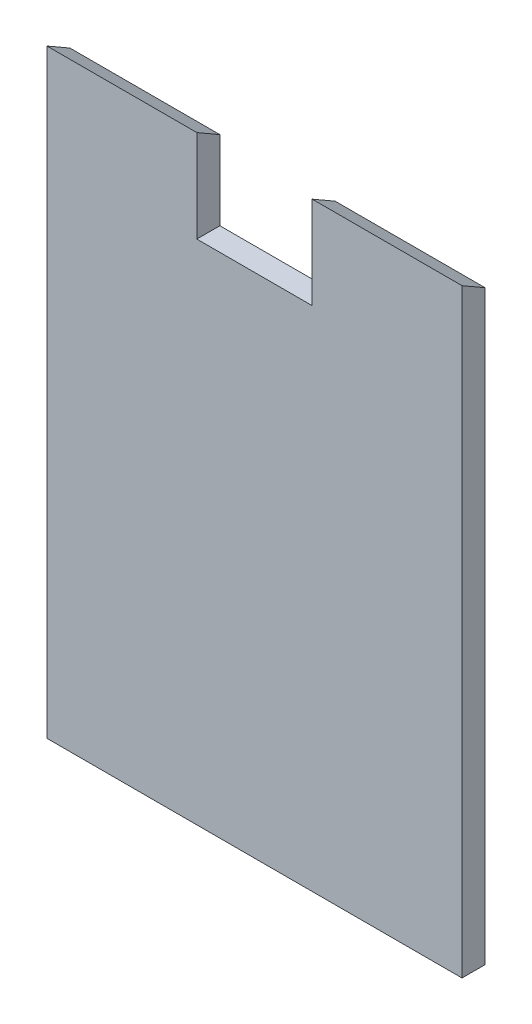
ISO-10303-21;
HEADER;
FILE_DESCRIPTION(('STEP AP214'),'2;1');
FILE_NAME('part.step','',(''),(''),'','','');
FILE_SCHEMA(('AUTOMOTIVE_DESIGN { 1 0 10303 214 1 1 1 1 }'));
ENDSEC;
DATA;
#1=APPLICATION_CONTEXT('core data for automotive mechanical design processes');
#2=APPLICATION_PROTOCOL_DEFINITION('international standard','automotive_design',2000,#1);
#3=PRODUCT_CONTEXT('',#1,'mechanical');
#4=PRODUCT('Part','Part','',(#3));
#5=PRODUCT_RELATED_PRODUCT_CATEGORY('part','',(#4));
#6=PRODUCT_DEFINITION_FORMATION('','',#4);
#7=PRODUCT_DEFINITION_CONTEXT('part definition',#1,'design');
#8=PRODUCT_DEFINITION('design','',#6,#7);
#9=PRODUCT_DEFINITION_SHAPE('','',#8);
#10=(LENGTH_UNIT() NAMED_UNIT(*) SI_UNIT(.MILLI.,.METRE.));
#11=(NAMED_UNIT(*) PLANE_ANGLE_UNIT() SI_UNIT($,.RADIAN.));
#12=(NAMED_UNIT(*) SI_UNIT($,.STERADIAN.) SOLID_ANGLE_UNIT());
#13=UNCERTAINTY_MEASURE_WITH_UNIT(LENGTH_MEASURE(1.E-05),#10,'distance_accuracy_value','');
#14=(GEOMETRIC_REPRESENTATION_CONTEXT(3) GLOBAL_UNCERTAINTY_ASSIGNED_CONTEXT((#13)) GLOBAL_UNIT_ASSIGNED_CONTEXT((#10,
#11,#12)) REPRESENTATION_CONTEXT('',''));
#15=CARTESIAN_POINT('',(0.,0.,0.));
#16=DIRECTION('',(0.,0.,1.));
#17=DIRECTION('',(1.,0.,0.));
#18=AXIS2_PLACEMENT_3D('',#15,#16,#17);
#19=CARTESIAN_POINT('',(-114.3,-165.1,6.35));
#20=DIRECTION('',(1.,0.,0.));
#21=DIRECTION('',(0.,1.,0.));
#22=AXIS2_PLACEMENT_3D('',#19,#20,#21);
#23=PLANE('',#22);
#24=DIRECTION('',(0.,-1.,0.));
#25=VECTOR('',#24,1.);
#26=CARTESIAN_POINT('',(-114.3,-165.1,6.35));
#27=LINE('',#26,#25);
#28=CARTESIAN_POINT('',(-114.3,165.1,6.35));
#29=VERTEX_POINT('',#28);
#30=CARTESIAN_POINT('',(-114.3,-165.1,6.35));
#31=VERTEX_POINT('',#30);
#32=EDGE_CURVE('E104',#29,#31,#27,.T.);
#33=ORIENTED_EDGE('',*,*,#32,.F.);
#34=DIRECTION('',(0.,-0.500000000000001,-0.866025403784438));
#35=VECTOR('',#34,1.);
#36=CARTESIAN_POINT('',(-114.3,82.5499999999998,-136.630794164811));
#37=LINE('',#36,#35);
#38=CARTESIAN_POINT('',(-114.3,157.767651581292,-6.35000000000002));
#39=VERTEX_POINT('',#38);
#40=EDGE_CURVE('E94',#29,#39,#37,.T.);
#41=ORIENTED_EDGE('',*,*,#40,.T.);
#42=DIRECTION('',(0.,-1.,0.));
#43=VECTOR('',#42,1.);
#44=CARTESIAN_POINT('',(-114.3,-165.1,-6.35));
#45=LINE('',#44,#43);
#46=CARTESIAN_POINT('',(-114.3,-165.1,-6.35));
#47=VERTEX_POINT('',#46);
#48=EDGE_CURVE('E101',#39,#47,#45,.T.);
#49=ORIENTED_EDGE('',*,*,#48,.T.);
#50=DIRECTION('',(0.,0.,-1.));
#51=VECTOR('',#50,1.);
#52=CARTESIAN_POINT('',(-114.3,-165.1,6.35));
#53=LINE('',#52,#51);
#54=EDGE_CURVE('E106',#31,#47,#53,.T.);
#55=ORIENTED_EDGE('',*,*,#54,.F.);
#56=EDGE_LOOP('',(#33,#41,#49,#55));
#57=FACE_BOUND('',#56,.T.);
#58=ADVANCED_FACE('F33',(#57),#23,.F.);
#59=CARTESIAN_POINT('',(114.3,-165.1,6.35));
#60=DIRECTION('',(0.,1.,0.));
#61=DIRECTION('',(-1.,0.,0.));
#62=AXIS2_PLACEMENT_3D('',#59,#60,#61);
#63=PLANE('',#62);
#64=DIRECTION('',(1.,0.,0.));
#65=VECTOR('',#64,1.);
#66=CARTESIAN_POINT('',(114.3,-165.1,-6.35));
#67=LINE('',#66,#65);
#68=CARTESIAN_POINT('',(114.3,-165.1,-6.35));
#69=VERTEX_POINT('',#68);
#70=EDGE_CURVE('E136',#47,#69,#67,.T.);
#71=ORIENTED_EDGE('',*,*,#70,.T.);
#72=DIRECTION('',(0.,0.,-1.));
#73=VECTOR('',#72,1.);
#74=CARTESIAN_POINT('',(114.3,-165.1,6.35));
#75=LINE('',#74,#73);
#76=CARTESIAN_POINT('',(114.3,-165.1,6.35));
#77=VERTEX_POINT('',#76);
#78=EDGE_CURVE('E149',#77,#69,#75,.T.);
#79=ORIENTED_EDGE('',*,*,#78,.F.);
#80=DIRECTION('',(1.,0.,0.));
#81=VECTOR('',#80,1.);
#82=CARTESIAN_POINT('',(114.3,-165.1,6.35));
#83=LINE('',#82,#81);
#84=EDGE_CURVE('E109',#31,#77,#83,.T.);
#85=ORIENTED_EDGE('',*,*,#84,.F.);
#86=ORIENTED_EDGE('',*,*,#54,.T.);
#87=EDGE_LOOP('',(#71,#79,#85,#86));
#88=FACE_BOUND('',#87,.T.);
#89=ADVANCED_FACE('F153',(#88),#63,.F.);
#90=CARTESIAN_POINT('',(114.3,-165.1,6.35));
#91=DIRECTION('',(-1.,0.,0.));
#92=DIRECTION('',(0.,-1.,0.));
#93=AXIS2_PLACEMENT_3D('',#90,#91,#92);
#94=PLANE('',#93);
#95=DIRECTION('',(0.,1.,0.));
#96=VECTOR('',#95,1.);
#97=CARTESIAN_POINT('',(114.3,-165.1,-6.35));
#98=LINE('',#97,#96);
#99=CARTESIAN_POINT('',(114.3,157.767651581292,-6.35));
#100=VERTEX_POINT('',#99);
#101=EDGE_CURVE('E138',#69,#100,#98,.T.);
#102=ORIENTED_EDGE('',*,*,#101,.T.);
#103=DIRECTION('',(0.,0.500000000000001,0.866025403784438));
#104=VECTOR('',#103,1.);
#105=CARTESIAN_POINT('',(114.3,82.5499999999997,-136.630794164811));
#106=LINE('',#105,#104);
#107=CARTESIAN_POINT('',(114.3,165.1,6.35));
#108=VERTEX_POINT('',#107);
#109=EDGE_CURVE('E46',#100,#108,#106,.T.);
#110=ORIENTED_EDGE('',*,*,#109,.T.);
#111=DIRECTION('',(0.,1.,0.));
#112=VECTOR('',#111,1.);
#113=CARTESIAN_POINT('',(114.3,-165.1,6.35));
#114=LINE('',#113,#112);
#115=EDGE_CURVE('E123',#77,#108,#114,.T.);
#116=ORIENTED_EDGE('',*,*,#115,.F.);
#117=ORIENTED_EDGE('',*,*,#78,.T.);
#118=EDGE_LOOP('',(#102,#110,#116,#117));
#119=FACE_BOUND('',#118,.T.);
#120=ADVANCED_FACE('F160',(#119),#94,.F.);
#121=CARTESIAN_POINT('',(31.75,114.3,6.35));
#122=DIRECTION('',(1.,0.,0.));
#123=DIRECTION('',(0.,1.,0.));
#124=AXIS2_PLACEMENT_3D('',#121,#122,#123);
#125=PLANE('',#124);
#126=DIRECTION('',(0.,-1.,0.));
#127=VECTOR('',#126,1.);
#128=CARTESIAN_POINT('',(31.75,114.3,6.35));
#129=LINE('',#128,#127);
#130=CARTESIAN_POINT('',(31.7499999999998,165.1,6.35));
#131=VERTEX_POINT('',#130);
#132=CARTESIAN_POINT('',(31.75,114.3,6.35));
#133=VERTEX_POINT('',#132);
#134=EDGE_CURVE('E129',#131,#133,#129,.T.);
#135=ORIENTED_EDGE('',*,*,#134,.F.);
#136=DIRECTION('',(0.,-0.500000000000001,-0.866025403784438));
#137=VECTOR('',#136,1.);
#138=CARTESIAN_POINT('',(31.7499999999999,152.4,-15.6470452561248));
#139=LINE('',#138,#137);
#140=CARTESIAN_POINT('',(31.7499999999999,157.767651581292,-6.35000000000002));
#141=VERTEX_POINT('',#140);
#142=EDGE_CURVE('E167',#131,#141,#139,.T.);
#143=ORIENTED_EDGE('',*,*,#142,.T.);
#144=DIRECTION('',(0.,-1.,0.));
#145=VECTOR('',#144,1.);
#146=CARTESIAN_POINT('',(31.75,114.3,-6.35));
#147=LINE('',#146,#145);
#148=CARTESIAN_POINT('',(31.75,114.3,-6.35));
#149=VERTEX_POINT('',#148);
#150=EDGE_CURVE('E141',#141,#149,#147,.T.);
#151=ORIENTED_EDGE('',*,*,#150,.T.);
#152=DIRECTION('',(0.,0.,-1.));
#153=VECTOR('',#152,1.);
#154=CARTESIAN_POINT('',(31.75,114.3,6.35));
#155=LINE('',#154,#153);
#156=EDGE_CURVE('E146',#133,#149,#155,.T.);
#157=ORIENTED_EDGE('',*,*,#156,.F.);
#158=EDGE_LOOP('',(#135,#143,#151,#157));
#159=FACE_BOUND('',#158,.T.);
#160=ADVANCED_FACE('F166',(#159),#125,.F.);
#161=CARTESIAN_POINT('',(-31.75,114.3,6.35));
#162=DIRECTION('',(0.,-1.,0.));
#163=DIRECTION('',(0.,0.,-1.));
#164=AXIS2_PLACEMENT_3D('',#161,#162,#163);
#165=PLANE('',#164);
#166=DIRECTION('',(-1.,0.,0.));
#167=VECTOR('',#166,1.);
#168=CARTESIAN_POINT('',(-31.75,114.3,-6.35));
#169=LINE('',#168,#167);
#170=CARTESIAN_POINT('',(-31.75,114.3,-6.35));
#171=VERTEX_POINT('',#170);
#172=EDGE_CURVE('E118',#149,#171,#169,.T.);
#173=ORIENTED_EDGE('',*,*,#172,.T.);
#174=DIRECTION('',(0.,0.,-1.));
#175=VECTOR('',#174,1.);
#176=CARTESIAN_POINT('',(-31.75,114.3,6.35));
#177=LINE('',#176,#175);
#178=CARTESIAN_POINT('',(-31.75,114.3,6.35));
#179=VERTEX_POINT('',#178);
#180=EDGE_CURVE('E134',#179,#171,#177,.T.);
#181=ORIENTED_EDGE('',*,*,#180,.F.);
#182=DIRECTION('',(-1.,0.,0.));
#183=VECTOR('',#182,1.);
#184=CARTESIAN_POINT('',(-31.75,114.3,6.35));
#185=LINE('',#184,#183);
#186=EDGE_CURVE('E131',#133,#179,#185,.T.);
#187=ORIENTED_EDGE('',*,*,#186,.F.);
#188=ORIENTED_EDGE('',*,*,#156,.T.);
#189=EDGE_LOOP('',(#173,#181,#187,#188));
#190=FACE_BOUND('',#189,.T.);
#191=ADVANCED_FACE('F172',(#190),#165,.F.);
#192=CARTESIAN_POINT('',(-31.75,114.3,6.35));
#193=DIRECTION('',(-1.,0.,0.));
#194=DIRECTION('',(0.,-1.,0.));
#195=AXIS2_PLACEMENT_3D('',#192,#193,#194);
#196=PLANE('',#195);
#197=DIRECTION('',(0.,1.,0.));
#198=VECTOR('',#197,1.);
#199=CARTESIAN_POINT('',(-31.75,114.3,-6.35));
#200=LINE('',#199,#198);
#201=CARTESIAN_POINT('',(-31.7500000000001,157.767651581292,-6.35));
#202=VERTEX_POINT('',#201);
#203=EDGE_CURVE('E115',#171,#202,#200,.T.);
#204=ORIENTED_EDGE('',*,*,#203,.T.);
#205=DIRECTION('',(0.,0.500000000000001,0.866025403784438));
#206=VECTOR('',#205,1.);
#207=CARTESIAN_POINT('',(-31.7500000000001,152.4,-15.6470452561248));
#208=LINE('',#207,#206);
#209=CARTESIAN_POINT('',(-31.7500000000002,165.1,6.35));
#210=VERTEX_POINT('',#209);
#211=EDGE_CURVE('E54',#202,#210,#208,.T.);
#212=ORIENTED_EDGE('',*,*,#211,.T.);
#213=DIRECTION('',(0.,1.,0.));
#214=VECTOR('',#213,1.);
#215=CARTESIAN_POINT('',(-31.75,114.3,6.35));
#216=LINE('',#215,#214);
#217=EDGE_CURVE('E114',#179,#210,#216,.T.);
#218=ORIENTED_EDGE('',*,*,#217,.F.);
#219=ORIENTED_EDGE('',*,*,#180,.T.);
#220=EDGE_LOOP('',(#204,#212,#218,#219));
#221=FACE_BOUND('',#220,.T.);
#222=ADVANCED_FACE('F175',(#221),#196,.F.);
#223=CARTESIAN_POINT('',(0.,0.,6.35));
#224=DIRECTION('',(0.,0.,-1.));
#225=DIRECTION('',(-1.,0.,0.));
#226=AXIS2_PLACEMENT_3D('',#223,#224,#225);
#227=PLANE('',#226);
#228=DIRECTION('',(-1.,0.,0.));
#229=VECTOR('',#228,1.);
#230=CARTESIAN_POINT('',(-31.7500000000002,165.1,6.35));
#231=LINE('',#230,#229);
#232=EDGE_CURVE('E98',#210,#29,#231,.T.);
#233=ORIENTED_EDGE('',*,*,#232,.T.);
#234=ORIENTED_EDGE('',*,*,#32,.T.);
#235=ORIENTED_EDGE('',*,*,#84,.T.);
#236=ORIENTED_EDGE('',*,*,#115,.T.);
#237=DIRECTION('',(-1.,0.,0.));
#238=VECTOR('',#237,1.);
#239=CARTESIAN_POINT('',(114.3,165.1,6.35));
#240=LINE('',#239,#238);
#241=EDGE_CURVE('E126',#108,#131,#240,.T.);
#242=ORIENTED_EDGE('',*,*,#241,.T.);
#243=ORIENTED_EDGE('',*,*,#134,.T.);
#244=ORIENTED_EDGE('',*,*,#186,.T.);
#245=ORIENTED_EDGE('',*,*,#217,.T.);
#246=EDGE_LOOP('',(#233,#234,#235,#236,#242,#243,#244,#245));
#247=FACE_BOUND('',#246,.T.);
#248=ADVANCED_FACE('F112',(#247),#227,.F.);
#249=CARTESIAN_POINT('',(0.,0.,-6.35));
#250=DIRECTION('',(0.,0.,-1.));
#251=DIRECTION('',(-1.,0.,0.));
#252=AXIS2_PLACEMENT_3D('',#249,#250,#251);
#253=PLANE('',#252);
#254=DIRECTION('',(-1.,0.,0.));
#255=VECTOR('',#254,1.);
#256=CARTESIAN_POINT('',(0.,157.767651581292,-6.35));
#257=LINE('',#256,#255);
#258=EDGE_CURVE('E11',#100,#141,#257,.T.);
#259=ORIENTED_EDGE('',*,*,#258,.F.);
#260=ORIENTED_EDGE('',*,*,#101,.F.);
#261=ORIENTED_EDGE('',*,*,#70,.F.);
#262=ORIENTED_EDGE('',*,*,#48,.F.);
#263=EDGE_CURVE('E36',#202,#39,#257,.T.);
#264=ORIENTED_EDGE('',*,*,#263,.F.);
#265=ORIENTED_EDGE('',*,*,#203,.F.);
#266=ORIENTED_EDGE('',*,*,#172,.F.);
#267=ORIENTED_EDGE('',*,*,#150,.F.);
#268=EDGE_LOOP('',(#259,#260,#261,#262,#264,#265,#266,#267));
#269=FACE_BOUND('',#268,.T.);
#270=ADVANCED_FACE('F157',(#269),#253,.T.);
#271=CARTESIAN_POINT('',(-127.,165.1,6.35));
#272=DIRECTION('',(0.,-0.866025403784438,0.500000000000001));
#273=DIRECTION('',(0.,-0.500000000000001,-0.866025403784438));
#274=AXIS2_PLACEMENT_3D('',#271,#272,#273);
#275=PLANE('',#274);
#276=ORIENTED_EDGE('',*,*,#232,.F.);
#277=ORIENTED_EDGE('',*,*,#211,.F.);
#278=ORIENTED_EDGE('',*,*,#263,.T.);
#279=ORIENTED_EDGE('',*,*,#40,.F.);
#280=EDGE_LOOP('',(#276,#277,#278,#279));
#281=FACE_BOUND('',#280,.T.);
#282=ADVANCED_FACE('F96',(#281),#275,.F.);
#283=ORIENTED_EDGE('',*,*,#258,.T.);
#284=ORIENTED_EDGE('',*,*,#142,.F.);
#285=ORIENTED_EDGE('',*,*,#241,.F.);
#286=ORIENTED_EDGE('',*,*,#109,.F.);
#287=EDGE_LOOP('',(#283,#284,#285,#286));
#288=FACE_BOUND('',#287,.T.);
#289=ADVANCED_FACE('F244',(#288),#275,.F.);
#290=CLOSED_SHELL('',(#58,#89,#120,#160,#191,#222,#248,#270,#282,#289));
#291=MANIFOLD_SOLID_BREP('B2',#290);
#292=ADVANCED_BREP_SHAPE_REPRESENTATION('',(#18,#291),#14);
#293=SHAPE_DEFINITION_REPRESENTATION(#9,#292);
ENDSEC;
END-ISO-10303-21;
